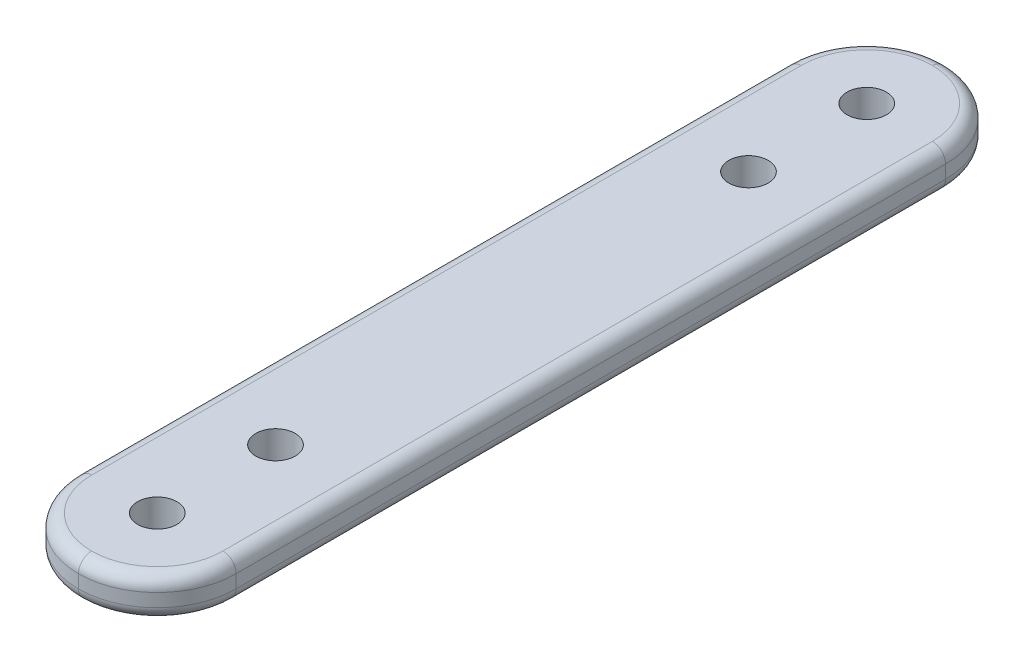
ISO-10303-21;
HEADER;
FILE_DESCRIPTION(('STEP AP214'),'2;1');
FILE_NAME('part.step','',(''),(''),'','','');
FILE_SCHEMA(('AUTOMOTIVE_DESIGN { 1 0 10303 214 1 1 1 1 }'));
ENDSEC;
DATA;
#1=APPLICATION_CONTEXT('core data for automotive mechanical design processes');
#2=APPLICATION_PROTOCOL_DEFINITION('international standard','automotive_design',2000,#1);
#3=PRODUCT_CONTEXT('',#1,'mechanical');
#4=PRODUCT('Part','Part','',(#3));
#5=PRODUCT_RELATED_PRODUCT_CATEGORY('part','',(#4));
#6=PRODUCT_DEFINITION_FORMATION('','',#4);
#7=PRODUCT_DEFINITION_CONTEXT('part definition',#1,'design');
#8=PRODUCT_DEFINITION('design','',#6,#7);
#9=PRODUCT_DEFINITION_SHAPE('','',#8);
#10=(LENGTH_UNIT() NAMED_UNIT(*) SI_UNIT(.MILLI.,.METRE.));
#11=(NAMED_UNIT(*) PLANE_ANGLE_UNIT() SI_UNIT($,.RADIAN.));
#12=(NAMED_UNIT(*) SI_UNIT($,.STERADIAN.) SOLID_ANGLE_UNIT());
#13=UNCERTAINTY_MEASURE_WITH_UNIT(LENGTH_MEASURE(1.E-05),#10,'distance_accuracy_value','');
#14=(GEOMETRIC_REPRESENTATION_CONTEXT(3) GLOBAL_UNCERTAINTY_ASSIGNED_CONTEXT((#13)) GLOBAL_UNIT_ASSIGNED_CONTEXT((#10,
#11,#12)) REPRESENTATION_CONTEXT('',''));
#15=CARTESIAN_POINT('',(0.,0.,0.));
#16=DIRECTION('',(0.,0.,1.));
#17=DIRECTION('',(1.,0.,0.));
#18=AXIS2_PLACEMENT_3D('',#15,#16,#17);
#19=CARTESIAN_POINT('',(0.,6.35,0.));
#20=DIRECTION('',(0.,-1.,0.));
#21=DIRECTION('',(0.,0.,-1.));
#22=AXIS2_PLACEMENT_3D('',#19,#20,#21);
#23=PLANE('',#22);
#24=CARTESIAN_POINT('',(0.,6.35,57.15));
#25=DIRECTION('',(0.,-1.,0.));
#26=DIRECTION('',(0.,0.,-1.));
#27=AXIS2_PLACEMENT_3D('',#24,#25,#26);
#28=CIRCLE('',#27,10.5833333333333);
#29=CARTESIAN_POINT('',(-10.5833333333333,6.35,57.15));
#30=VERTEX_POINT('',#29);
#31=CARTESIAN_POINT('',(0.,6.35,67.7333333333333));
#32=VERTEX_POINT('',#31);
#33=EDGE_CURVE('E149',#30,#32,#28,.F.);
#34=ORIENTED_EDGE('',*,*,#33,.T.);
#35=CARTESIAN_POINT('',(0.,6.35,57.15));
#36=DIRECTION('',(0.,-1.,0.));
#37=DIRECTION('',(0.,0.,-1.));
#38=AXIS2_PLACEMENT_3D('',#35,#36,#37);
#39=CIRCLE('',#38,10.5833333333333);
#40=CARTESIAN_POINT('',(10.5833333333333,6.35,57.15));
#41=VERTEX_POINT('',#40);
#42=EDGE_CURVE('E130',#32,#41,#39,.F.);
#43=ORIENTED_EDGE('',*,*,#42,.T.);
#44=DIRECTION('',(0.,0.,-1.));
#45=VECTOR('',#44,1.);
#46=CARTESIAN_POINT('',(10.5833333333333,6.35,0.));
#47=LINE('',#46,#45);
#48=CARTESIAN_POINT('',(10.5833333333333,6.35,-57.15));
#49=VERTEX_POINT('',#48);
#50=EDGE_CURVE('E138',#41,#49,#47,.T.);
#51=ORIENTED_EDGE('',*,*,#50,.T.);
#52=CARTESIAN_POINT('',(0.,6.35,-57.15));
#53=DIRECTION('',(0.,-1.,0.));
#54=DIRECTION('',(0.,0.,-1.));
#55=AXIS2_PLACEMENT_3D('',#52,#53,#54);
#56=CIRCLE('',#55,10.5833333333333);
#57=CARTESIAN_POINT('',(0.,6.35,-67.7333333333333));
#58=VERTEX_POINT('',#57);
#59=EDGE_CURVE('E144',#49,#58,#56,.F.);
#60=ORIENTED_EDGE('',*,*,#59,.T.);
#61=CARTESIAN_POINT('',(0.,6.35,-57.15));
#62=DIRECTION('',(0.,-1.,0.));
#63=DIRECTION('',(0.,0.,-1.));
#64=AXIS2_PLACEMENT_3D('',#61,#62,#63);
#65=CIRCLE('',#64,10.5833333333333);
#66=CARTESIAN_POINT('',(-10.5833333333333,6.35,-57.15));
#67=VERTEX_POINT('',#66);
#68=EDGE_CURVE('E253',#58,#67,#65,.F.);
#69=ORIENTED_EDGE('',*,*,#68,.T.);
#70=DIRECTION('',(0.,0.,1.));
#71=VECTOR('',#70,1.);
#72=CARTESIAN_POINT('',(-10.5833333333333,6.35,0.));
#73=LINE('',#72,#71);
#74=EDGE_CURVE('E155',#67,#30,#73,.T.);
#75=ORIENTED_EDGE('',*,*,#74,.T.);
#76=EDGE_LOOP('',(#34,#43,#51,#60,#69,#75));
#77=FACE_BOUND('',#76,.T.);
#78=CARTESIAN_POINT('',(0.,6.35,57.15));
#79=DIRECTION('',(0.,1.,0.));
#80=DIRECTION('',(0.,0.,1.));
#81=AXIS2_PLACEMENT_3D('',#78,#79,#80);
#82=CIRCLE('',#81,3.175);
#83=CARTESIAN_POINT('',(0.,6.35,60.325));
#84=VERTEX_POINT('',#83);
#85=EDGE_CURVE('E242',#84,#84,#82,.T.);
#86=ORIENTED_EDGE('',*,*,#85,.F.);
#87=EDGE_LOOP('',(#86));
#88=FACE_BOUND('',#87,.T.);
#89=CARTESIAN_POINT('',(0.,6.35,-38.1));
#90=DIRECTION('',(0.,1.,0.));
#91=DIRECTION('',(0.,0.,1.));
#92=AXIS2_PLACEMENT_3D('',#89,#90,#91);
#93=CIRCLE('',#92,3.175);
#94=CARTESIAN_POINT('',(0.,6.35,-34.925));
#95=VERTEX_POINT('',#94);
#96=EDGE_CURVE('E506',#95,#95,#93,.T.);
#97=ORIENTED_EDGE('',*,*,#96,.F.);
#98=EDGE_LOOP('',(#97));
#99=FACE_BOUND('',#98,.T.);
#100=CARTESIAN_POINT('',(0.,6.35,-57.15));
#101=DIRECTION('',(0.,1.,0.));
#102=DIRECTION('',(0.,0.,1.));
#103=AXIS2_PLACEMENT_3D('',#100,#101,#102);
#104=CIRCLE('',#103,3.175);
#105=CARTESIAN_POINT('',(0.,6.35,-53.975));
#106=VERTEX_POINT('',#105);
#107=EDGE_CURVE('E494',#106,#106,#104,.T.);
#108=ORIENTED_EDGE('',*,*,#107,.F.);
#109=EDGE_LOOP('',(#108));
#110=FACE_BOUND('',#109,.T.);
#111=CARTESIAN_POINT('',(0.,6.35,38.1));
#112=DIRECTION('',(0.,1.,0.));
#113=DIRECTION('',(0.,0.,1.));
#114=AXIS2_PLACEMENT_3D('',#111,#112,#113);
#115=CIRCLE('',#114,3.175);
#116=CARTESIAN_POINT('',(0.,6.35,41.275));
#117=VERTEX_POINT('',#116);
#118=EDGE_CURVE('E498',#117,#117,#115,.T.);
#119=ORIENTED_EDGE('',*,*,#118,.F.);
#120=EDGE_LOOP('',(#119));
#121=FACE_BOUND('',#120,.T.);
#122=ADVANCED_FACE('F33',(#77,#88,#99,#110,#121),#23,.F.);
#123=CARTESIAN_POINT('',(0.,0.,0.));
#124=DIRECTION('',(0.,-1.,0.));
#125=DIRECTION('',(0.,0.,-1.));
#126=AXIS2_PLACEMENT_3D('',#123,#124,#125);
#127=PLANE('',#126);
#128=DIRECTION('',(0.,0.,-1.));
#129=VECTOR('',#128,1.);
#130=CARTESIAN_POINT('',(10.5833333333333,0.,57.15));
#131=LINE('',#130,#129);
#132=CARTESIAN_POINT('',(10.5833333333333,0.,-57.15));
#133=VERTEX_POINT('',#132);
#134=CARTESIAN_POINT('',(10.5833333333333,0.,57.15));
#135=VERTEX_POINT('',#134);
#136=EDGE_CURVE('E176',#133,#135,#131,.F.);
#137=ORIENTED_EDGE('',*,*,#136,.T.);
#138=CARTESIAN_POINT('',(0.,0.,57.15));
#139=DIRECTION('',(0.,-1.,0.));
#140=DIRECTION('',(0.,0.,-1.));
#141=AXIS2_PLACEMENT_3D('',#138,#139,#140);
#142=CIRCLE('',#141,10.5833333333333);
#143=CARTESIAN_POINT('',(0.,0.,67.7333333333333));
#144=VERTEX_POINT('',#143);
#145=EDGE_CURVE('E185',#135,#144,#142,.T.);
#146=ORIENTED_EDGE('',*,*,#145,.T.);
#147=CARTESIAN_POINT('',(0.,0.,57.15));
#148=DIRECTION('',(0.,-1.,0.));
#149=DIRECTION('',(0.,0.,-1.));
#150=AXIS2_PLACEMENT_3D('',#147,#148,#149);
#151=CIRCLE('',#150,10.5833333333333);
#152=CARTESIAN_POINT('',(-10.5833333333333,0.,57.15));
#153=VERTEX_POINT('',#152);
#154=EDGE_CURVE('E57',#144,#153,#151,.T.);
#155=ORIENTED_EDGE('',*,*,#154,.T.);
#156=DIRECTION('',(0.,0.,1.));
#157=VECTOR('',#156,1.);
#158=CARTESIAN_POINT('',(-10.5833333333333,0.,-57.15));
#159=LINE('',#158,#157);
#160=CARTESIAN_POINT('',(-10.5833333333333,0.,-57.15));
#161=VERTEX_POINT('',#160);
#162=EDGE_CURVE('E182',#153,#161,#159,.F.);
#163=ORIENTED_EDGE('',*,*,#162,.T.);
#164=CARTESIAN_POINT('',(0.,0.,-57.15));
#165=DIRECTION('',(0.,-1.,0.));
#166=DIRECTION('',(0.,0.,-1.));
#167=AXIS2_PLACEMENT_3D('',#164,#165,#166);
#168=CIRCLE('',#167,10.5833333333333);
#169=CARTESIAN_POINT('',(0.,0.,-67.7333333333333));
#170=VERTEX_POINT('',#169);
#171=EDGE_CURVE('E180',#161,#170,#168,.T.);
#172=ORIENTED_EDGE('',*,*,#171,.T.);
#173=CARTESIAN_POINT('',(0.,0.,-57.15));
#174=DIRECTION('',(0.,-1.,0.));
#175=DIRECTION('',(0.,0.,-1.));
#176=AXIS2_PLACEMENT_3D('',#173,#174,#175);
#177=CIRCLE('',#176,10.5833333333333);
#178=EDGE_CURVE('E178',#170,#133,#177,.T.);
#179=ORIENTED_EDGE('',*,*,#178,.T.);
#180=EDGE_LOOP('',(#137,#146,#155,#163,#172,#179));
#181=FACE_BOUND('',#180,.T.);
#182=CARTESIAN_POINT('',(0.,0.,-57.15));
#183=DIRECTION('',(0.,1.,0.));
#184=DIRECTION('',(0.,0.,1.));
#185=AXIS2_PLACEMENT_3D('',#182,#183,#184);
#186=CIRCLE('',#185,3.175);
#187=CARTESIAN_POINT('',(0.,0.,-53.975));
#188=VERTEX_POINT('',#187);
#189=EDGE_CURVE('E497',#188,#188,#186,.T.);
#190=ORIENTED_EDGE('',*,*,#189,.T.);
#191=EDGE_LOOP('',(#190));
#192=FACE_BOUND('',#191,.T.);
#193=CARTESIAN_POINT('',(0.,0.,57.15));
#194=DIRECTION('',(0.,1.,0.));
#195=DIRECTION('',(0.,0.,1.));
#196=AXIS2_PLACEMENT_3D('',#193,#194,#195);
#197=CIRCLE('',#196,3.175);
#198=CARTESIAN_POINT('',(0.,0.,60.325));
#199=VERTEX_POINT('',#198);
#200=EDGE_CURVE('E509',#199,#199,#197,.T.);
#201=ORIENTED_EDGE('',*,*,#200,.T.);
#202=EDGE_LOOP('',(#201));
#203=FACE_BOUND('',#202,.T.);
#204=CARTESIAN_POINT('',(0.,0.,-38.1));
#205=DIRECTION('',(0.,1.,0.));
#206=DIRECTION('',(0.,0.,1.));
#207=AXIS2_PLACEMENT_3D('',#204,#205,#206);
#208=CIRCLE('',#207,3.175);
#209=CARTESIAN_POINT('',(0.,0.,-34.925));
#210=VERTEX_POINT('',#209);
#211=EDGE_CURVE('E500',#210,#210,#208,.T.);
#212=ORIENTED_EDGE('',*,*,#211,.T.);
#213=EDGE_LOOP('',(#212));
#214=FACE_BOUND('',#213,.T.);
#215=CARTESIAN_POINT('',(0.,0.,38.1));
#216=DIRECTION('',(0.,1.,0.));
#217=DIRECTION('',(0.,0.,1.));
#218=AXIS2_PLACEMENT_3D('',#215,#216,#217);
#219=CIRCLE('',#218,3.175);
#220=CARTESIAN_POINT('',(0.,0.,41.275));
#221=VERTEX_POINT('',#220);
#222=EDGE_CURVE('E249',#221,#221,#219,.T.);
#223=ORIENTED_EDGE('',*,*,#222,.T.);
#224=EDGE_LOOP('',(#223));
#225=FACE_BOUND('',#224,.T.);
#226=ADVANCED_FACE('F273',(#181,#192,#203,#214,#225),#127,.T.);
#227=CARTESIAN_POINT('',(12.7,6.35,69.85));
#228=DIRECTION('',(-1.,0.,0.));
#229=DIRECTION('',(0.,0.,1.));
#230=AXIS2_PLACEMENT_3D('',#227,#228,#229);
#231=PLANE('',#230);
#232=DIRECTION('',(0.,-1.,0.));
#233=VECTOR('',#232,1.);
#234=CARTESIAN_POINT('',(12.7,6.35,-57.15));
#235=LINE('',#234,#233);
#236=CARTESIAN_POINT('',(12.7,2.11666666666667,-57.15));
#237=VERTEX_POINT('',#236);
#238=CARTESIAN_POINT('',(12.7,4.23333333333333,-57.15));
#239=VERTEX_POINT('',#238);
#240=EDGE_CURVE('E145',#237,#239,#235,.F.);
#241=ORIENTED_EDGE('',*,*,#240,.T.);
#242=DIRECTION('',(0.,0.,-1.));
#243=VECTOR('',#242,1.);
#244=CARTESIAN_POINT('',(12.7,4.23333333333333,69.85));
#245=LINE('',#244,#243);
#246=CARTESIAN_POINT('',(12.7,4.23333333333333,57.15));
#247=VERTEX_POINT('',#246);
#248=EDGE_CURVE('E11',#239,#247,#245,.F.);
#249=ORIENTED_EDGE('',*,*,#248,.T.);
#250=DIRECTION('',(0.,-1.,0.));
#251=VECTOR('',#250,1.);
#252=CARTESIAN_POINT('',(12.7,6.35,57.15));
#253=LINE('',#252,#251);
#254=CARTESIAN_POINT('',(12.7,2.11666666666667,57.15));
#255=VERTEX_POINT('',#254);
#256=EDGE_CURVE('E237',#247,#255,#253,.T.);
#257=ORIENTED_EDGE('',*,*,#256,.T.);
#258=DIRECTION('',(0.,0.,-1.));
#259=VECTOR('',#258,1.);
#260=CARTESIAN_POINT('',(12.7,2.11666666666667,-57.15));
#261=LINE('',#260,#259);
#262=EDGE_CURVE('E42',#255,#237,#261,.T.);
#263=ORIENTED_EDGE('',*,*,#262,.T.);
#264=EDGE_LOOP('',(#241,#249,#257,#263));
#265=FACE_BOUND('',#264,.T.);
#266=ADVANCED_FACE('F283',(#265),#231,.F.);
#267=CARTESIAN_POINT('',(-12.7,6.35,69.85));
#268=DIRECTION('',(1.,0.,0.));
#269=DIRECTION('',(0.,0.,-1.));
#270=AXIS2_PLACEMENT_3D('',#267,#268,#269);
#271=PLANE('',#270);
#272=DIRECTION('',(0.,-1.,0.));
#273=VECTOR('',#272,1.);
#274=CARTESIAN_POINT('',(-12.7,6.35,57.15));
#275=LINE('',#274,#273);
#276=CARTESIAN_POINT('',(-12.7,2.11666666666667,57.15));
#277=VERTEX_POINT('',#276);
#278=CARTESIAN_POINT('',(-12.7,4.23333333333333,57.15));
#279=VERTEX_POINT('',#278);
#280=EDGE_CURVE('E238',#277,#279,#275,.F.);
#281=ORIENTED_EDGE('',*,*,#280,.T.);
#282=DIRECTION('',(0.,0.,1.));
#283=VECTOR('',#282,1.);
#284=CARTESIAN_POINT('',(-12.7,4.23333333333333,69.85));
#285=LINE('',#284,#283);
#286=CARTESIAN_POINT('',(-12.7,4.23333333333333,-57.15));
#287=VERTEX_POINT('',#286);
#288=EDGE_CURVE('E166',#279,#287,#285,.F.);
#289=ORIENTED_EDGE('',*,*,#288,.T.);
#290=DIRECTION('',(0.,-1.,0.));
#291=VECTOR('',#290,1.);
#292=CARTESIAN_POINT('',(-12.7,6.35,-57.15));
#293=LINE('',#292,#291);
#294=CARTESIAN_POINT('',(-12.7,2.11666666666667,-57.15));
#295=VERTEX_POINT('',#294);
#296=EDGE_CURVE('E228',#287,#295,#293,.T.);
#297=ORIENTED_EDGE('',*,*,#296,.T.);
#298=DIRECTION('',(0.,0.,1.));
#299=VECTOR('',#298,1.);
#300=CARTESIAN_POINT('',(-12.7,2.11666666666667,57.15));
#301=LINE('',#300,#299);
#302=EDGE_CURVE('E164',#295,#277,#301,.T.);
#303=ORIENTED_EDGE('',*,*,#302,.T.);
#304=EDGE_LOOP('',(#281,#289,#297,#303));
#305=FACE_BOUND('',#304,.T.);
#306=ADVANCED_FACE('F234',(#305),#271,.F.);
#307=CARTESIAN_POINT('',(0.,6.35,57.15));
#308=DIRECTION('',(0.,-1.,0.));
#309=DIRECTION('',(0.,0.,-1.));
#310=AXIS2_PLACEMENT_3D('',#307,#308,#309);
#311=CYLINDRICAL_SURFACE('',#310,3.175);
#312=ORIENTED_EDGE('',*,*,#85,.T.);
#313=EDGE_LOOP('',(#312));
#314=FACE_BOUND('',#313,.T.);
#315=ORIENTED_EDGE('',*,*,#200,.F.);
#316=EDGE_LOOP('',(#315));
#317=FACE_BOUND('',#316,.T.);
#318=ADVANCED_FACE('F311',(#314,#317),#311,.F.);
#319=CARTESIAN_POINT('',(0.,6.35,-38.1));
#320=DIRECTION('',(0.,-1.,0.));
#321=DIRECTION('',(0.,0.,-1.));
#322=AXIS2_PLACEMENT_3D('',#319,#320,#321);
#323=CYLINDRICAL_SURFACE('',#322,3.175);
#324=ORIENTED_EDGE('',*,*,#96,.T.);
#325=EDGE_LOOP('',(#324));
#326=FACE_BOUND('',#325,.T.);
#327=ORIENTED_EDGE('',*,*,#211,.F.);
#328=EDGE_LOOP('',(#327));
#329=FACE_BOUND('',#328,.T.);
#330=ADVANCED_FACE('F331',(#326,#329),#323,.F.);
#331=CARTESIAN_POINT('',(0.,6.35,-57.15));
#332=DIRECTION('',(0.,-1.,0.));
#333=DIRECTION('',(0.,0.,-1.));
#334=AXIS2_PLACEMENT_3D('',#331,#332,#333);
#335=CYLINDRICAL_SURFACE('',#334,3.175);
#336=ORIENTED_EDGE('',*,*,#107,.T.);
#337=EDGE_LOOP('',(#336));
#338=FACE_BOUND('',#337,.T.);
#339=ORIENTED_EDGE('',*,*,#189,.F.);
#340=EDGE_LOOP('',(#339));
#341=FACE_BOUND('',#340,.T.);
#342=ADVANCED_FACE('F300',(#338,#341),#335,.F.);
#343=CARTESIAN_POINT('',(0.,6.35,38.1));
#344=DIRECTION('',(0.,-1.,0.));
#345=DIRECTION('',(0.,0.,-1.));
#346=AXIS2_PLACEMENT_3D('',#343,#344,#345);
#347=CYLINDRICAL_SURFACE('',#346,3.175);
#348=ORIENTED_EDGE('',*,*,#118,.T.);
#349=EDGE_LOOP('',(#348));
#350=FACE_BOUND('',#349,.T.);
#351=ORIENTED_EDGE('',*,*,#222,.F.);
#352=EDGE_LOOP('',(#351));
#353=FACE_BOUND('',#352,.T.);
#354=ADVANCED_FACE('F293',(#350,#353),#347,.F.);
#355=CARTESIAN_POINT('',(0.,6.35,-57.15));
#356=DIRECTION('',(0.,-1.,0.));
#357=DIRECTION('',(0.,0.,-1.));
#358=AXIS2_PLACEMENT_3D('',#355,#356,#357);
#359=CYLINDRICAL_SURFACE('',#358,12.7);
#360=DIRECTION('',(0.,-1.,0.));
#361=VECTOR('',#360,1.);
#362=CARTESIAN_POINT('',(0.,6.35,-69.85));
#363=LINE('',#362,#361);
#364=CARTESIAN_POINT('',(0.,4.23333333333333,-69.85));
#365=VERTEX_POINT('',#364);
#366=CARTESIAN_POINT('',(0.,2.11666666666667,-69.85));
#367=VERTEX_POINT('',#366);
#368=EDGE_CURVE('E231',#365,#367,#363,.T.);
#369=ORIENTED_EDGE('',*,*,#368,.F.);
#370=CARTESIAN_POINT('',(0.,4.23333333333333,-57.15));
#371=DIRECTION('',(0.,-1.,0.));
#372=DIRECTION('',(0.,0.,-1.));
#373=AXIS2_PLACEMENT_3D('',#370,#371,#372);
#374=CIRCLE('',#373,12.7);
#375=EDGE_CURVE('E174',#365,#239,#374,.T.);
#376=ORIENTED_EDGE('',*,*,#375,.T.);
#377=ORIENTED_EDGE('',*,*,#240,.F.);
#378=CARTESIAN_POINT('',(0.,2.11666666666667,-57.15));
#379=DIRECTION('',(0.,-1.,0.));
#380=DIRECTION('',(0.,0.,-1.));
#381=AXIS2_PLACEMENT_3D('',#378,#379,#380);
#382=CIRCLE('',#381,12.7);
#383=EDGE_CURVE('E172',#237,#367,#382,.F.);
#384=ORIENTED_EDGE('',*,*,#383,.T.);
#385=EDGE_LOOP('',(#369,#376,#377,#384));
#386=FACE_BOUND('',#385,.T.);
#387=ADVANCED_FACE('F291',(#386),#359,.T.);
#388=CARTESIAN_POINT('',(0.,6.35,-57.15));
#389=DIRECTION('',(0.,-1.,0.));
#390=DIRECTION('',(0.,0.,-1.));
#391=AXIS2_PLACEMENT_3D('',#388,#389,#390);
#392=CYLINDRICAL_SURFACE('',#391,12.7);
#393=ORIENTED_EDGE('',*,*,#296,.F.);
#394=CARTESIAN_POINT('',(0.,4.23333333333333,-57.15));
#395=DIRECTION('',(0.,-1.,0.));
#396=DIRECTION('',(0.,0.,-1.));
#397=AXIS2_PLACEMENT_3D('',#394,#395,#396);
#398=CIRCLE('',#397,12.7);
#399=EDGE_CURVE('E170',#287,#365,#398,.T.);
#400=ORIENTED_EDGE('',*,*,#399,.T.);
#401=ORIENTED_EDGE('',*,*,#368,.T.);
#402=CARTESIAN_POINT('',(0.,2.11666666666667,-57.15));
#403=DIRECTION('',(0.,-1.,0.));
#404=DIRECTION('',(0.,0.,-1.));
#405=AXIS2_PLACEMENT_3D('',#402,#403,#404);
#406=CIRCLE('',#405,12.7);
#407=EDGE_CURVE('E168',#367,#295,#406,.F.);
#408=ORIENTED_EDGE('',*,*,#407,.T.);
#409=EDGE_LOOP('',(#393,#400,#401,#408));
#410=FACE_BOUND('',#409,.T.);
#411=ADVANCED_FACE('F227',(#410),#392,.T.);
#412=CARTESIAN_POINT('',(0.,6.35,57.15));
#413=DIRECTION('',(0.,-1.,0.));
#414=DIRECTION('',(0.,0.,-1.));
#415=AXIS2_PLACEMENT_3D('',#412,#413,#414);
#416=CYLINDRICAL_SURFACE('',#415,12.7);
#417=ORIENTED_EDGE('',*,*,#256,.F.);
#418=CARTESIAN_POINT('',(0.,4.23333333333333,57.15));
#419=DIRECTION('',(0.,-1.,0.));
#420=DIRECTION('',(0.,0.,-1.));
#421=AXIS2_PLACEMENT_3D('',#418,#419,#420);
#422=CIRCLE('',#421,12.7);
#423=CARTESIAN_POINT('',(0.,4.23333333333333,69.85));
#424=VERTEX_POINT('',#423);
#425=EDGE_CURVE('E132',#247,#424,#422,.T.);
#426=ORIENTED_EDGE('',*,*,#425,.T.);
#427=DIRECTION('',(0.,-1.,0.));
#428=VECTOR('',#427,1.);
#429=CARTESIAN_POINT('',(0.,6.35,69.85));
#430=LINE('',#429,#428);
#431=CARTESIAN_POINT('',(0.,2.11666666666667,69.85));
#432=VERTEX_POINT('',#431);
#433=EDGE_CURVE('E199',#432,#424,#430,.F.);
#434=ORIENTED_EDGE('',*,*,#433,.F.);
#435=CARTESIAN_POINT('',(0.,2.11666666666667,57.15));
#436=DIRECTION('',(0.,-1.,0.));
#437=DIRECTION('',(0.,0.,-1.));
#438=AXIS2_PLACEMENT_3D('',#435,#436,#437);
#439=CIRCLE('',#438,12.7);
#440=EDGE_CURVE('E151',#432,#255,#439,.F.);
#441=ORIENTED_EDGE('',*,*,#440,.T.);
#442=EDGE_LOOP('',(#417,#426,#434,#441));
#443=FACE_BOUND('',#442,.T.);
#444=ADVANCED_FACE('F267',(#443),#416,.T.);
#445=CARTESIAN_POINT('',(0.,6.35,57.15));
#446=DIRECTION('',(0.,-1.,0.));
#447=DIRECTION('',(0.,0.,-1.));
#448=AXIS2_PLACEMENT_3D('',#445,#446,#447);
#449=CYLINDRICAL_SURFACE('',#448,12.7);
#450=ORIENTED_EDGE('',*,*,#433,.T.);
#451=CARTESIAN_POINT('',(0.,4.23333333333333,57.15));
#452=DIRECTION('',(0.,-1.,0.));
#453=DIRECTION('',(0.,0.,-1.));
#454=AXIS2_PLACEMENT_3D('',#451,#452,#453);
#455=CIRCLE('',#454,12.7);
#456=EDGE_CURVE('E162',#424,#279,#455,.T.);
#457=ORIENTED_EDGE('',*,*,#456,.T.);
#458=ORIENTED_EDGE('',*,*,#280,.F.);
#459=CARTESIAN_POINT('',(0.,2.11666666666667,57.15));
#460=DIRECTION('',(0.,-1.,0.));
#461=DIRECTION('',(0.,0.,-1.));
#462=AXIS2_PLACEMENT_3D('',#459,#460,#461);
#463=CIRCLE('',#462,12.7);
#464=EDGE_CURVE('E160',#277,#432,#463,.F.);
#465=ORIENTED_EDGE('',*,*,#464,.T.);
#466=EDGE_LOOP('',(#450,#457,#458,#465));
#467=FACE_BOUND('',#466,.T.);
#468=ADVANCED_FACE('F268',(#467),#449,.T.);
#469=CARTESIAN_POINT('',(0.,4.23333333333333,-57.15));
#470=DIRECTION('',(0.,-1.,0.));
#471=DIRECTION('',(0.,0.,-1.));
#472=AXIS2_PLACEMENT_3D('',#469,#470,#471);
#473=TOROIDAL_SURFACE('',#472,10.5833333333333,2.11666666666667);
#474=CARTESIAN_POINT('',(0.,4.23333333333333,-67.7333333333333));
#475=DIRECTION('',(1.,0.,0.));
#476=DIRECTION('',(0.,0.,-1.));
#477=AXIS2_PLACEMENT_3D('',#474,#475,#476);
#478=CIRCLE('',#477,2.11666666666667);
#479=EDGE_CURVE('E193',#365,#58,#478,.T.);
#480=ORIENTED_EDGE('',*,*,#479,.F.);
#481=ORIENTED_EDGE('',*,*,#399,.F.);
#482=CARTESIAN_POINT('',(-10.5833333333333,4.23333333333333,-57.15));
#483=DIRECTION('',(0.,0.,1.));
#484=DIRECTION('',(1.,0.,0.));
#485=AXIS2_PLACEMENT_3D('',#482,#483,#484);
#486=CIRCLE('',#485,2.11666666666667);
#487=EDGE_CURVE('E196',#67,#287,#486,.T.);
#488=ORIENTED_EDGE('',*,*,#487,.F.);
#489=ORIENTED_EDGE('',*,*,#68,.F.);
#490=EDGE_LOOP('',(#480,#481,#488,#489));
#491=FACE_BOUND('',#490,.T.);
#492=ADVANCED_FACE('F290',(#491),#473,.T.);
#493=CARTESIAN_POINT('',(-10.5833333333333,4.23333333333333,0.));
#494=DIRECTION('',(0.,0.,1.));
#495=DIRECTION('',(1.,0.,0.));
#496=AXIS2_PLACEMENT_3D('',#493,#494,#495);
#497=CYLINDRICAL_SURFACE('',#496,2.11666666666667);
#498=ORIENTED_EDGE('',*,*,#487,.T.);
#499=ORIENTED_EDGE('',*,*,#288,.F.);
#500=CARTESIAN_POINT('',(-10.5833333333333,4.23333333333333,57.15));
#501=DIRECTION('',(0.,0.,1.));
#502=DIRECTION('',(1.,0.,0.));
#503=AXIS2_PLACEMENT_3D('',#500,#501,#502);
#504=CIRCLE('',#503,2.11666666666667);
#505=EDGE_CURVE('E190',#30,#279,#504,.T.);
#506=ORIENTED_EDGE('',*,*,#505,.F.);
#507=ORIENTED_EDGE('',*,*,#74,.F.);
#508=EDGE_LOOP('',(#498,#499,#506,#507));
#509=FACE_BOUND('',#508,.T.);
#510=ADVANCED_FACE('F259',(#509),#497,.T.);
#511=CARTESIAN_POINT('',(0.,4.23333333333333,-57.15));
#512=DIRECTION('',(0.,-1.,0.));
#513=DIRECTION('',(0.,0.,-1.));
#514=AXIS2_PLACEMENT_3D('',#511,#512,#513);
#515=TOROIDAL_SURFACE('',#514,10.5833333333333,2.11666666666667);
#516=ORIENTED_EDGE('',*,*,#479,.T.);
#517=ORIENTED_EDGE('',*,*,#59,.F.);
#518=CARTESIAN_POINT('',(10.5833333333333,4.23333333333333,-57.15));
#519=DIRECTION('',(0.,0.,1.));
#520=DIRECTION('',(1.,0.,0.));
#521=AXIS2_PLACEMENT_3D('',#518,#519,#520);
#522=CIRCLE('',#521,2.11666666666667);
#523=EDGE_CURVE('E141',#239,#49,#522,.T.);
#524=ORIENTED_EDGE('',*,*,#523,.F.);
#525=ORIENTED_EDGE('',*,*,#375,.F.);
#526=EDGE_LOOP('',(#516,#517,#524,#525));
#527=FACE_BOUND('',#526,.T.);
#528=ADVANCED_FACE('F287',(#527),#515,.T.);
#529=CARTESIAN_POINT('',(0.,4.23333333333333,57.15));
#530=DIRECTION('',(0.,-1.,0.));
#531=DIRECTION('',(0.,0.,-1.));
#532=AXIS2_PLACEMENT_3D('',#529,#530,#531);
#533=TOROIDAL_SURFACE('',#532,10.5833333333333,2.11666666666667);
#534=ORIENTED_EDGE('',*,*,#505,.T.);
#535=ORIENTED_EDGE('',*,*,#456,.F.);
#536=CARTESIAN_POINT('',(0.,4.23333333333333,67.7333333333333));
#537=DIRECTION('',(1.,0.,0.));
#538=DIRECTION('',(0.,0.,-1.));
#539=AXIS2_PLACEMENT_3D('',#536,#537,#538);
#540=CIRCLE('',#539,2.11666666666667);
#541=EDGE_CURVE('E135',#32,#424,#540,.T.);
#542=ORIENTED_EDGE('',*,*,#541,.F.);
#543=ORIENTED_EDGE('',*,*,#33,.F.);
#544=EDGE_LOOP('',(#534,#535,#542,#543));
#545=FACE_BOUND('',#544,.T.);
#546=ADVANCED_FACE('F262',(#545),#533,.T.);
#547=CARTESIAN_POINT('',(10.5833333333333,4.23333333333333,0.));
#548=DIRECTION('',(0.,0.,-1.));
#549=DIRECTION('',(-1.,0.,0.));
#550=AXIS2_PLACEMENT_3D('',#547,#548,#549);
#551=CYLINDRICAL_SURFACE('',#550,2.11666666666667);
#552=ORIENTED_EDGE('',*,*,#523,.T.);
#553=ORIENTED_EDGE('',*,*,#50,.F.);
#554=CARTESIAN_POINT('',(10.5833333333333,4.23333333333333,57.15));
#555=DIRECTION('',(0.,0.,1.));
#556=DIRECTION('',(1.,0.,0.));
#557=AXIS2_PLACEMENT_3D('',#554,#555,#556);
#558=CIRCLE('',#557,2.11666666666667);
#559=EDGE_CURVE('E126',#247,#41,#558,.T.);
#560=ORIENTED_EDGE('',*,*,#559,.F.);
#561=ORIENTED_EDGE('',*,*,#248,.F.);
#562=EDGE_LOOP('',(#552,#553,#560,#561));
#563=FACE_BOUND('',#562,.T.);
#564=ADVANCED_FACE('F139',(#563),#551,.T.);
#565=CARTESIAN_POINT('',(0.,4.23333333333333,57.15));
#566=DIRECTION('',(0.,-1.,0.));
#567=DIRECTION('',(0.,0.,-1.));
#568=AXIS2_PLACEMENT_3D('',#565,#566,#567);
#569=TOROIDAL_SURFACE('',#568,10.5833333333333,2.11666666666667);
#570=ORIENTED_EDGE('',*,*,#541,.T.);
#571=ORIENTED_EDGE('',*,*,#425,.F.);
#572=ORIENTED_EDGE('',*,*,#559,.T.);
#573=ORIENTED_EDGE('',*,*,#42,.F.);
#574=EDGE_LOOP('',(#570,#571,#572,#573));
#575=FACE_BOUND('',#574,.T.);
#576=ADVANCED_FACE('F128',(#575),#569,.T.);
#577=CARTESIAN_POINT('',(0.,2.11666666666667,-57.15));
#578=DIRECTION('',(0.,-1.,0.));
#579=DIRECTION('',(0.,0.,-1.));
#580=AXIS2_PLACEMENT_3D('',#577,#578,#579);
#581=TOROIDAL_SURFACE('',#580,10.5833333333333,2.11666666666667);
#582=CARTESIAN_POINT('',(-10.5833333333333,2.11666666666667,-57.15));
#583=DIRECTION('',(0.,0.,1.));
#584=DIRECTION('',(1.,0.,0.));
#585=AXIS2_PLACEMENT_3D('',#582,#583,#584);
#586=CIRCLE('',#585,2.11666666666667);
#587=EDGE_CURVE('E208',#295,#161,#586,.T.);
#588=ORIENTED_EDGE('',*,*,#587,.F.);
#589=ORIENTED_EDGE('',*,*,#407,.F.);
#590=CARTESIAN_POINT('',(0.,2.11666666666667,-67.7333333333333));
#591=DIRECTION('',(1.,0.,0.));
#592=DIRECTION('',(0.,0.,-1.));
#593=AXIS2_PLACEMENT_3D('',#590,#591,#592);
#594=CIRCLE('',#593,2.11666666666667);
#595=EDGE_CURVE('E37',#170,#367,#594,.T.);
#596=ORIENTED_EDGE('',*,*,#595,.F.);
#597=ORIENTED_EDGE('',*,*,#171,.F.);
#598=EDGE_LOOP('',(#588,#589,#596,#597));
#599=FACE_BOUND('',#598,.T.);
#600=ADVANCED_FACE('F35',(#599),#581,.T.);
#601=CARTESIAN_POINT('',(0.,2.11666666666667,-57.15));
#602=DIRECTION('',(0.,-1.,0.));
#603=DIRECTION('',(0.,0.,-1.));
#604=AXIS2_PLACEMENT_3D('',#601,#602,#603);
#605=TOROIDAL_SURFACE('',#604,10.5833333333333,2.11666666666667);
#606=ORIENTED_EDGE('',*,*,#595,.T.);
#607=ORIENTED_EDGE('',*,*,#383,.F.);
#608=CARTESIAN_POINT('',(10.5833333333333,2.11666666666667,-57.15));
#609=DIRECTION('',(0.,0.,1.));
#610=DIRECTION('',(1.,0.,0.));
#611=AXIS2_PLACEMENT_3D('',#608,#609,#610);
#612=CIRCLE('',#611,2.11666666666667);
#613=EDGE_CURVE('E206',#133,#237,#612,.T.);
#614=ORIENTED_EDGE('',*,*,#613,.F.);
#615=ORIENTED_EDGE('',*,*,#178,.F.);
#616=EDGE_LOOP('',(#606,#607,#614,#615));
#617=FACE_BOUND('',#616,.T.);
#618=ADVANCED_FACE('F218',(#617),#605,.T.);
#619=CARTESIAN_POINT('',(-10.5833333333333,2.11666666666667,69.85));
#620=DIRECTION('',(0.,0.,-1.));
#621=DIRECTION('',(-1.,0.,0.));
#622=AXIS2_PLACEMENT_3D('',#619,#620,#621);
#623=CYLINDRICAL_SURFACE('',#622,2.11666666666667);
#624=ORIENTED_EDGE('',*,*,#587,.T.);
#625=ORIENTED_EDGE('',*,*,#162,.F.);
#626=CARTESIAN_POINT('',(-10.5833333333333,2.11666666666667,57.15));
#627=DIRECTION('',(0.,0.,1.));
#628=DIRECTION('',(1.,0.,0.));
#629=AXIS2_PLACEMENT_3D('',#626,#627,#628);
#630=CIRCLE('',#629,2.11666666666667);
#631=EDGE_CURVE('E203',#277,#153,#630,.T.);
#632=ORIENTED_EDGE('',*,*,#631,.F.);
#633=ORIENTED_EDGE('',*,*,#302,.F.);
#634=EDGE_LOOP('',(#624,#625,#632,#633));
#635=FACE_BOUND('',#634,.T.);
#636=ADVANCED_FACE('F447',(#635),#623,.T.);
#637=CARTESIAN_POINT('',(10.5833333333334,2.11666666666667,69.85));
#638=DIRECTION('',(0.,0.,1.));
#639=DIRECTION('',(1.,0.,0.));
#640=AXIS2_PLACEMENT_3D('',#637,#638,#639);
#641=CYLINDRICAL_SURFACE('',#640,2.11666666666667);
#642=ORIENTED_EDGE('',*,*,#613,.T.);
#643=ORIENTED_EDGE('',*,*,#262,.F.);
#644=CARTESIAN_POINT('',(10.5833333333333,2.11666666666667,57.15));
#645=DIRECTION('',(0.,0.,1.));
#646=DIRECTION('',(1.,0.,0.));
#647=AXIS2_PLACEMENT_3D('',#644,#645,#646);
#648=CIRCLE('',#647,2.11666666666667);
#649=EDGE_CURVE('E201',#135,#255,#648,.T.);
#650=ORIENTED_EDGE('',*,*,#649,.F.);
#651=ORIENTED_EDGE('',*,*,#136,.F.);
#652=EDGE_LOOP('',(#642,#643,#650,#651));
#653=FACE_BOUND('',#652,.T.);
#654=ADVANCED_FACE('F280',(#653),#641,.T.);
#655=CARTESIAN_POINT('',(0.,2.11666666666667,57.15));
#656=DIRECTION('',(0.,-1.,0.));
#657=DIRECTION('',(0.,0.,-1.));
#658=AXIS2_PLACEMENT_3D('',#655,#656,#657);
#659=TOROIDAL_SURFACE('',#658,10.5833333333333,2.11666666666667);
#660=ORIENTED_EDGE('',*,*,#631,.T.);
#661=ORIENTED_EDGE('',*,*,#154,.F.);
#662=CARTESIAN_POINT('',(0.,2.11666666666667,67.7333333333333));
#663=DIRECTION('',(1.,0.,0.));
#664=DIRECTION('',(0.,0.,-1.));
#665=AXIS2_PLACEMENT_3D('',#662,#663,#664);
#666=CIRCLE('',#665,2.11666666666667);
#667=EDGE_CURVE('E50',#432,#144,#666,.T.);
#668=ORIENTED_EDGE('',*,*,#667,.F.);
#669=ORIENTED_EDGE('',*,*,#464,.F.);
#670=EDGE_LOOP('',(#660,#661,#668,#669));
#671=FACE_BOUND('',#670,.T.);
#672=ADVANCED_FACE('F272',(#671),#659,.T.);
#673=CARTESIAN_POINT('',(0.,2.11666666666667,57.15));
#674=DIRECTION('',(0.,-1.,0.));
#675=DIRECTION('',(0.,0.,-1.));
#676=AXIS2_PLACEMENT_3D('',#673,#674,#675);
#677=TOROIDAL_SURFACE('',#676,10.5833333333333,2.11666666666667);
#678=ORIENTED_EDGE('',*,*,#649,.T.);
#679=ORIENTED_EDGE('',*,*,#440,.F.);
#680=ORIENTED_EDGE('',*,*,#667,.T.);
#681=ORIENTED_EDGE('',*,*,#145,.F.);
#682=EDGE_LOOP('',(#678,#679,#680,#681));
#683=FACE_BOUND('',#682,.T.);
#684=ADVANCED_FACE('F277',(#683),#677,.T.);
#685=CLOSED_SHELL('',(#122,#226,#266,#306,#318,#330,#342,#354,#387,#411,#444,#468,#492,#510,
#528,#546,#564,#576,#600,#618,#636,#654,#672,#684));
#686=MANIFOLD_SOLID_BREP('B2',#685);
#687=ADVANCED_BREP_SHAPE_REPRESENTATION('',(#18,#686),#14);
#688=SHAPE_DEFINITION_REPRESENTATION(#9,#687);
ENDSEC;
END-ISO-10303-21;
